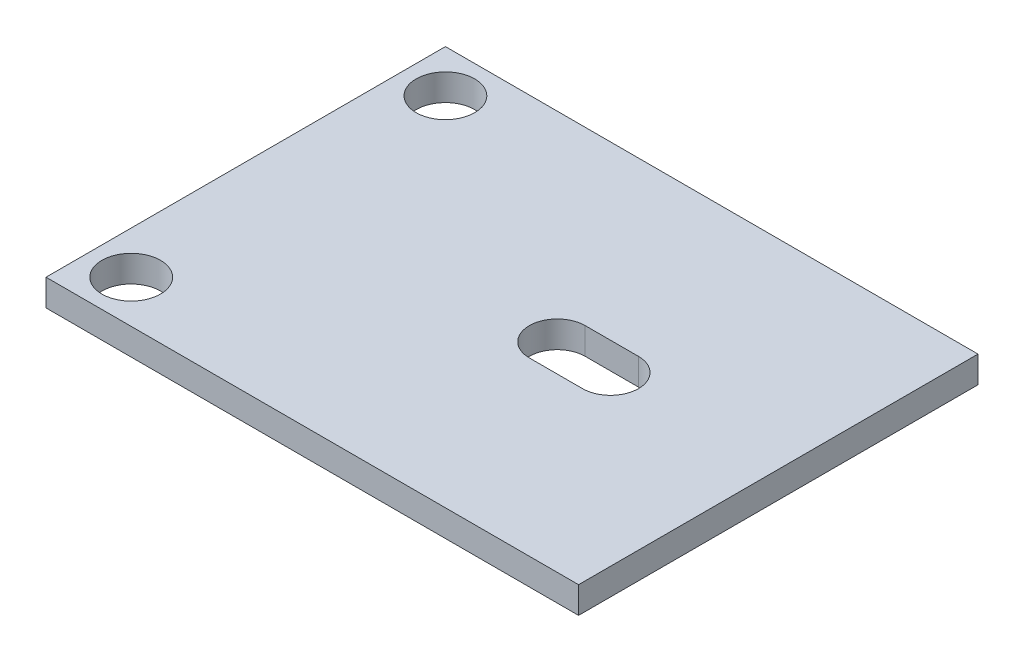
ISO-10303-21;
HEADER;
FILE_DESCRIPTION(('STEP AP214'),'2;1');
FILE_NAME('part.step','',(''),(''),'','','');
FILE_SCHEMA(('AUTOMOTIVE_DESIGN { 1 0 10303 214 1 1 1 1 }'));
ENDSEC;
DATA;
#1=APPLICATION_CONTEXT('core data for automotive mechanical design processes');
#2=APPLICATION_PROTOCOL_DEFINITION('international standard','automotive_design',2000,#1);
#3=PRODUCT_CONTEXT('',#1,'mechanical');
#4=PRODUCT('Part','Part','',(#3));
#5=PRODUCT_RELATED_PRODUCT_CATEGORY('part','',(#4));
#6=PRODUCT_DEFINITION_FORMATION('','',#4);
#7=PRODUCT_DEFINITION_CONTEXT('part definition',#1,'design');
#8=PRODUCT_DEFINITION('design','',#6,#7);
#9=PRODUCT_DEFINITION_SHAPE('','',#8);
#10=(LENGTH_UNIT() NAMED_UNIT(*) SI_UNIT(.MILLI.,.METRE.));
#11=(NAMED_UNIT(*) PLANE_ANGLE_UNIT() SI_UNIT($,.RADIAN.));
#12=(NAMED_UNIT(*) SI_UNIT($,.STERADIAN.) SOLID_ANGLE_UNIT());
#13=UNCERTAINTY_MEASURE_WITH_UNIT(LENGTH_MEASURE(1.E-05),#10,'distance_accuracy_value','');
#14=(GEOMETRIC_REPRESENTATION_CONTEXT(3) GLOBAL_UNCERTAINTY_ASSIGNED_CONTEXT((#13)) GLOBAL_UNIT_ASSIGNED_CONTEXT((#10,
#11,#12)) REPRESENTATION_CONTEXT('',''));
#15=CARTESIAN_POINT('',(0.,0.,0.));
#16=DIRECTION('',(0.,0.,1.));
#17=DIRECTION('',(1.,0.,0.));
#18=AXIS2_PLACEMENT_3D('',#15,#16,#17);
#19=CARTESIAN_POINT('',(0.,1.,7.5));
#20=DIRECTION('',(1.,0.,0.));
#21=DIRECTION('',(0.,0.,-1.));
#22=AXIS2_PLACEMENT_3D('',#19,#20,#21);
#23=PLANE('',#22);
#24=DIRECTION('',(0.,0.,1.));
#25=VECTOR('',#24,1.);
#26=CARTESIAN_POINT('',(0.,0.,7.5));
#27=LINE('',#26,#25);
#28=CARTESIAN_POINT('',(0.,0.,-7.5));
#29=VERTEX_POINT('',#28);
#30=CARTESIAN_POINT('',(0.,0.,7.5));
#31=VERTEX_POINT('',#30);
#32=EDGE_CURVE('E131',#29,#31,#27,.T.);
#33=ORIENTED_EDGE('',*,*,#32,.T.);
#34=DIRECTION('',(0.,-1.,0.));
#35=VECTOR('',#34,1.);
#36=CARTESIAN_POINT('',(0.,1.,7.5));
#37=LINE('',#36,#35);
#38=CARTESIAN_POINT('',(0.,1.,7.5));
#39=VERTEX_POINT('',#38);
#40=EDGE_CURVE('E11',#39,#31,#37,.T.);
#41=ORIENTED_EDGE('',*,*,#40,.F.);
#42=DIRECTION('',(0.,0.,1.));
#43=VECTOR('',#42,1.);
#44=CARTESIAN_POINT('',(0.,1.,7.5));
#45=LINE('',#44,#43);
#46=CARTESIAN_POINT('',(0.,1.,-7.5));
#47=VERTEX_POINT('',#46);
#48=EDGE_CURVE('E146',#47,#39,#45,.T.);
#49=ORIENTED_EDGE('',*,*,#48,.F.);
#50=DIRECTION('',(0.,-1.,0.));
#51=VECTOR('',#50,1.);
#52=CARTESIAN_POINT('',(0.,1.,-7.5));
#53=LINE('',#52,#51);
#54=EDGE_CURVE('E156',#47,#29,#53,.T.);
#55=ORIENTED_EDGE('',*,*,#54,.T.);
#56=EDGE_LOOP('',(#33,#41,#49,#55));
#57=FACE_BOUND('',#56,.T.);
#58=ADVANCED_FACE('F33',(#57),#23,.F.);
#59=CARTESIAN_POINT('',(0.,1.,7.5));
#60=DIRECTION('',(0.,0.,-1.));
#61=DIRECTION('',(-1.,0.,0.));
#62=AXIS2_PLACEMENT_3D('',#59,#60,#61);
#63=PLANE('',#62);
#64=DIRECTION('',(1.,0.,0.));
#65=VECTOR('',#64,1.);
#66=CARTESIAN_POINT('',(0.,0.,7.5));
#67=LINE('',#66,#65);
#68=CARTESIAN_POINT('',(20.,0.,7.5));
#69=VERTEX_POINT('',#68);
#70=EDGE_CURVE('E159',#31,#69,#67,.T.);
#71=ORIENTED_EDGE('',*,*,#70,.T.);
#72=DIRECTION('',(0.,-1.,0.));
#73=VECTOR('',#72,1.);
#74=CARTESIAN_POINT('',(20.,1.,7.5));
#75=LINE('',#74,#73);
#76=CARTESIAN_POINT('',(20.,1.,7.5));
#77=VERTEX_POINT('',#76);
#78=EDGE_CURVE('E40',#77,#69,#75,.T.);
#79=ORIENTED_EDGE('',*,*,#78,.F.);
#80=DIRECTION('',(1.,0.,0.));
#81=VECTOR('',#80,1.);
#82=CARTESIAN_POINT('',(0.,1.,7.5));
#83=LINE('',#82,#81);
#84=EDGE_CURVE('E149',#39,#77,#83,.T.);
#85=ORIENTED_EDGE('',*,*,#84,.F.);
#86=ORIENTED_EDGE('',*,*,#40,.T.);
#87=EDGE_LOOP('',(#71,#79,#85,#86));
#88=FACE_BOUND('',#87,.T.);
#89=ADVANCED_FACE('F188',(#88),#63,.F.);
#90=CARTESIAN_POINT('',(20.,1.,7.5));
#91=DIRECTION('',(-1.,0.,0.));
#92=DIRECTION('',(0.,0.,1.));
#93=AXIS2_PLACEMENT_3D('',#90,#91,#92);
#94=PLANE('',#93);
#95=DIRECTION('',(0.,0.,-1.));
#96=VECTOR('',#95,1.);
#97=CARTESIAN_POINT('',(20.,0.,7.5));
#98=LINE('',#97,#96);
#99=CARTESIAN_POINT('',(20.,0.,-7.5));
#100=VERTEX_POINT('',#99);
#101=EDGE_CURVE('E161',#69,#100,#98,.T.);
#102=ORIENTED_EDGE('',*,*,#101,.T.);
#103=DIRECTION('',(0.,-1.,0.));
#104=VECTOR('',#103,1.);
#105=CARTESIAN_POINT('',(20.,1.,-7.5));
#106=LINE('',#105,#104);
#107=CARTESIAN_POINT('',(20.,1.,-7.5));
#108=VERTEX_POINT('',#107);
#109=EDGE_CURVE('E166',#108,#100,#106,.T.);
#110=ORIENTED_EDGE('',*,*,#109,.F.);
#111=DIRECTION('',(0.,0.,-1.));
#112=VECTOR('',#111,1.);
#113=CARTESIAN_POINT('',(20.,1.,7.5));
#114=LINE('',#113,#112);
#115=EDGE_CURVE('E152',#77,#108,#114,.T.);
#116=ORIENTED_EDGE('',*,*,#115,.F.);
#117=ORIENTED_EDGE('',*,*,#78,.T.);
#118=EDGE_LOOP('',(#102,#110,#116,#117));
#119=FACE_BOUND('',#118,.T.);
#120=ADVANCED_FACE('F173',(#119),#94,.F.);
#121=CARTESIAN_POINT('',(0.,1.,-7.5));
#122=DIRECTION('',(0.,0.,1.));
#123=DIRECTION('',(1.,0.,0.));
#124=AXIS2_PLACEMENT_3D('',#121,#122,#123);
#125=PLANE('',#124);
#126=DIRECTION('',(-1.,0.,0.));
#127=VECTOR('',#126,1.);
#128=CARTESIAN_POINT('',(0.,0.,-7.5));
#129=LINE('',#128,#127);
#130=EDGE_CURVE('E150',#100,#29,#129,.T.);
#131=ORIENTED_EDGE('',*,*,#130,.T.);
#132=ORIENTED_EDGE('',*,*,#54,.F.);
#133=DIRECTION('',(-1.,0.,0.));
#134=VECTOR('',#133,1.);
#135=CARTESIAN_POINT('',(0.,1.,-7.5));
#136=LINE('',#135,#134);
#137=EDGE_CURVE('E154',#108,#47,#136,.T.);
#138=ORIENTED_EDGE('',*,*,#137,.F.);
#139=ORIENTED_EDGE('',*,*,#109,.T.);
#140=EDGE_LOOP('',(#131,#132,#138,#139));
#141=FACE_BOUND('',#140,.T.);
#142=ADVANCED_FACE('F181',(#141),#125,.F.);
#143=CARTESIAN_POINT('',(0.,1.,0.));
#144=DIRECTION('',(0.,-1.,0.));
#145=DIRECTION('',(0.,0.,-1.));
#146=AXIS2_PLACEMENT_3D('',#143,#144,#145);
#147=PLANE('',#146);
#148=DIRECTION('',(1.,0.,0.));
#149=VECTOR('',#148,1.);
#150=CARTESIAN_POINT('',(11.7,1.,1.05));
#151=LINE('',#150,#149);
#152=CARTESIAN_POINT('',(11.7,1.,1.05));
#153=VERTEX_POINT('',#152);
#154=CARTESIAN_POINT('',(13.7,1.,1.05));
#155=VERTEX_POINT('',#154);
#156=EDGE_CURVE('E124',#153,#155,#151,.T.);
#157=ORIENTED_EDGE('',*,*,#156,.F.);
#158=CARTESIAN_POINT('',(11.7,1.,0.));
#159=DIRECTION('',(0.,1.,0.));
#160=DIRECTION('',(0.,0.,1.));
#161=AXIS2_PLACEMENT_3D('',#158,#159,#160);
#162=CIRCLE('',#161,1.05);
#163=CARTESIAN_POINT('',(11.7,1.,-1.05));
#164=VERTEX_POINT('',#163);
#165=EDGE_CURVE('E47',#164,#153,#162,.T.);
#166=ORIENTED_EDGE('',*,*,#165,.F.);
#167=DIRECTION('',(-1.,0.,0.));
#168=VECTOR('',#167,1.);
#169=CARTESIAN_POINT('',(11.7,1.,-1.05));
#170=LINE('',#169,#168);
#171=CARTESIAN_POINT('',(13.7,1.,-1.05));
#172=VERTEX_POINT('',#171);
#173=EDGE_CURVE('E115',#172,#164,#170,.T.);
#174=ORIENTED_EDGE('',*,*,#173,.F.);
#175=CARTESIAN_POINT('',(13.7,1.,0.));
#176=DIRECTION('',(0.,1.,0.));
#177=DIRECTION('',(0.,0.,1.));
#178=AXIS2_PLACEMENT_3D('',#175,#176,#177);
#179=CIRCLE('',#178,1.05);
#180=EDGE_CURVE('E118',#155,#172,#179,.T.);
#181=ORIENTED_EDGE('',*,*,#180,.F.);
#182=EDGE_LOOP('',(#157,#166,#174,#181));
#183=FACE_BOUND('',#182,.T.);
#184=CARTESIAN_POINT('',(1.6,1.,-5.9));
#185=DIRECTION('',(0.,1.,0.));
#186=DIRECTION('',(0.,0.,1.));
#187=AXIS2_PLACEMENT_3D('',#184,#185,#186);
#188=CIRCLE('',#187,1.1);
#189=CARTESIAN_POINT('',(1.6,1.,-4.8));
#190=VERTEX_POINT('',#189);
#191=EDGE_CURVE('E137',#190,#190,#188,.T.);
#192=ORIENTED_EDGE('',*,*,#191,.F.);
#193=EDGE_LOOP('',(#192));
#194=FACE_BOUND('',#193,.T.);
#195=CARTESIAN_POINT('',(1.6,1.,5.9));
#196=DIRECTION('',(0.,1.,0.));
#197=DIRECTION('',(0.,0.,1.));
#198=AXIS2_PLACEMENT_3D('',#195,#196,#197);
#199=CIRCLE('',#198,1.1);
#200=CARTESIAN_POINT('',(1.6,1.,7.));
#201=VERTEX_POINT('',#200);
#202=EDGE_CURVE('E143',#201,#201,#199,.T.);
#203=ORIENTED_EDGE('',*,*,#202,.F.);
#204=EDGE_LOOP('',(#203));
#205=FACE_BOUND('',#204,.T.);
#206=ORIENTED_EDGE('',*,*,#48,.T.);
#207=ORIENTED_EDGE('',*,*,#84,.T.);
#208=ORIENTED_EDGE('',*,*,#115,.T.);
#209=ORIENTED_EDGE('',*,*,#137,.T.);
#210=EDGE_LOOP('',(#206,#207,#208,#209));
#211=FACE_BOUND('',#210,.T.);
#212=ADVANCED_FACE('F187',(#183,#194,#205,#211),#147,.F.);
#213=CARTESIAN_POINT('',(0.,0.,0.));
#214=DIRECTION('',(0.,-1.,0.));
#215=DIRECTION('',(0.,0.,-1.));
#216=AXIS2_PLACEMENT_3D('',#213,#214,#215);
#217=PLANE('',#216);
#218=CARTESIAN_POINT('',(11.7,0.,0.));
#219=DIRECTION('',(0.,1.,0.));
#220=DIRECTION('',(0.,0.,1.));
#221=AXIS2_PLACEMENT_3D('',#218,#219,#220);
#222=CIRCLE('',#221,1.05);
#223=CARTESIAN_POINT('',(11.7,0.,-1.05));
#224=VERTEX_POINT('',#223);
#225=CARTESIAN_POINT('',(11.7,0.,1.05));
#226=VERTEX_POINT('',#225);
#227=EDGE_CURVE('E99',#224,#226,#222,.T.);
#228=ORIENTED_EDGE('',*,*,#227,.T.);
#229=DIRECTION('',(1.,0.,0.));
#230=VECTOR('',#229,1.);
#231=CARTESIAN_POINT('',(11.7,0.,1.05));
#232=LINE('',#231,#230);
#233=CARTESIAN_POINT('',(13.7,0.,1.05));
#234=VERTEX_POINT('',#233);
#235=EDGE_CURVE('E108',#226,#234,#232,.T.);
#236=ORIENTED_EDGE('',*,*,#235,.T.);
#237=CARTESIAN_POINT('',(13.7,0.,0.));
#238=DIRECTION('',(0.,1.,0.));
#239=DIRECTION('',(0.,0.,1.));
#240=AXIS2_PLACEMENT_3D('',#237,#238,#239);
#241=CIRCLE('',#240,1.05);
#242=CARTESIAN_POINT('',(13.7,0.,-1.05));
#243=VERTEX_POINT('',#242);
#244=EDGE_CURVE('E55',#234,#243,#241,.T.);
#245=ORIENTED_EDGE('',*,*,#244,.T.);
#246=DIRECTION('',(-1.,0.,0.));
#247=VECTOR('',#246,1.);
#248=CARTESIAN_POINT('',(11.7,0.,-1.05));
#249=LINE('',#248,#247);
#250=EDGE_CURVE('E105',#243,#224,#249,.T.);
#251=ORIENTED_EDGE('',*,*,#250,.T.);
#252=EDGE_LOOP('',(#228,#236,#245,#251));
#253=FACE_BOUND('',#252,.T.);
#254=CARTESIAN_POINT('',(1.6,0.,-5.9));
#255=DIRECTION('',(0.,1.,0.));
#256=DIRECTION('',(0.,0.,1.));
#257=AXIS2_PLACEMENT_3D('',#254,#255,#256);
#258=CIRCLE('',#257,1.1);
#259=CARTESIAN_POINT('',(1.6,0.,-4.8));
#260=VERTEX_POINT('',#259);
#261=EDGE_CURVE('E125',#260,#260,#258,.T.);
#262=ORIENTED_EDGE('',*,*,#261,.T.);
#263=EDGE_LOOP('',(#262));
#264=FACE_BOUND('',#263,.T.);
#265=CARTESIAN_POINT('',(1.6,0.,5.9));
#266=DIRECTION('',(0.,1.,0.));
#267=DIRECTION('',(0.,0.,1.));
#268=AXIS2_PLACEMENT_3D('',#265,#266,#267);
#269=CIRCLE('',#268,1.1);
#270=CARTESIAN_POINT('',(1.6,0.,7.));
#271=VERTEX_POINT('',#270);
#272=EDGE_CURVE('E140',#271,#271,#269,.T.);
#273=ORIENTED_EDGE('',*,*,#272,.T.);
#274=EDGE_LOOP('',(#273));
#275=FACE_BOUND('',#274,.T.);
#276=ORIENTED_EDGE('',*,*,#32,.F.);
#277=ORIENTED_EDGE('',*,*,#130,.F.);
#278=ORIENTED_EDGE('',*,*,#101,.F.);
#279=ORIENTED_EDGE('',*,*,#70,.F.);
#280=EDGE_LOOP('',(#276,#277,#278,#279));
#281=FACE_BOUND('',#280,.T.);
#282=ADVANCED_FACE('F112',(#253,#264,#275,#281),#217,.T.);
#283=CARTESIAN_POINT('',(1.6,0.,5.9));
#284=DIRECTION('',(0.,1.,0.));
#285=DIRECTION('',(0.,0.,1.));
#286=AXIS2_PLACEMENT_3D('',#283,#284,#285);
#287=CYLINDRICAL_SURFACE('',#286,1.1);
#288=ORIENTED_EDGE('',*,*,#272,.F.);
#289=EDGE_LOOP('',(#288));
#290=FACE_BOUND('',#289,.T.);
#291=ORIENTED_EDGE('',*,*,#202,.T.);
#292=EDGE_LOOP('',(#291));
#293=FACE_BOUND('',#292,.T.);
#294=ADVANCED_FACE('F200',(#290,#293),#287,.F.);
#295=CARTESIAN_POINT('',(1.6,0.,-5.9));
#296=DIRECTION('',(0.,1.,0.));
#297=DIRECTION('',(0.,0.,1.));
#298=AXIS2_PLACEMENT_3D('',#295,#296,#297);
#299=CYLINDRICAL_SURFACE('',#298,1.1);
#300=ORIENTED_EDGE('',*,*,#261,.F.);
#301=EDGE_LOOP('',(#300));
#302=FACE_BOUND('',#301,.T.);
#303=ORIENTED_EDGE('',*,*,#191,.T.);
#304=EDGE_LOOP('',(#303));
#305=FACE_BOUND('',#304,.T.);
#306=ADVANCED_FACE('F206',(#302,#305),#299,.F.);
#307=CARTESIAN_POINT('',(11.7,0.,0.));
#308=DIRECTION('',(0.,1.,0.));
#309=DIRECTION('',(0.,0.,1.));
#310=AXIS2_PLACEMENT_3D('',#307,#308,#309);
#311=CYLINDRICAL_SURFACE('',#310,1.05);
#312=ORIENTED_EDGE('',*,*,#165,.T.);
#313=DIRECTION('',(0.,1.,0.));
#314=VECTOR('',#313,1.);
#315=CARTESIAN_POINT('',(11.7,0.,1.05));
#316=LINE('',#315,#314);
#317=EDGE_CURVE('E95',#226,#153,#316,.T.);
#318=ORIENTED_EDGE('',*,*,#317,.F.);
#319=ORIENTED_EDGE('',*,*,#227,.F.);
#320=DIRECTION('',(0.,1.,0.));
#321=VECTOR('',#320,1.);
#322=CARTESIAN_POINT('',(11.7,0.,-1.05));
#323=LINE('',#322,#321);
#324=EDGE_CURVE('E129',#224,#164,#323,.T.);
#325=ORIENTED_EDGE('',*,*,#324,.T.);
#326=EDGE_LOOP('',(#312,#318,#319,#325));
#327=FACE_BOUND('',#326,.T.);
#328=ADVANCED_FACE('F97',(#327),#311,.F.);
#329=CARTESIAN_POINT('',(11.7,0.,-1.05));
#330=DIRECTION('',(0.,0.,-1.));
#331=DIRECTION('',(-1.,0.,0.));
#332=AXIS2_PLACEMENT_3D('',#329,#330,#331);
#333=PLANE('',#332);
#334=ORIENTED_EDGE('',*,*,#173,.T.);
#335=ORIENTED_EDGE('',*,*,#324,.F.);
#336=ORIENTED_EDGE('',*,*,#250,.F.);
#337=DIRECTION('',(0.,1.,0.));
#338=VECTOR('',#337,1.);
#339=CARTESIAN_POINT('',(13.7,0.,-1.05));
#340=LINE('',#339,#338);
#341=EDGE_CURVE('E132',#243,#172,#340,.T.);
#342=ORIENTED_EDGE('',*,*,#341,.T.);
#343=EDGE_LOOP('',(#334,#335,#336,#342));
#344=FACE_BOUND('',#343,.T.);
#345=ADVANCED_FACE('F213',(#344),#333,.F.);
#346=CARTESIAN_POINT('',(13.7,0.,0.));
#347=DIRECTION('',(0.,1.,0.));
#348=DIRECTION('',(0.,0.,1.));
#349=AXIS2_PLACEMENT_3D('',#346,#347,#348);
#350=CYLINDRICAL_SURFACE('',#349,1.05);
#351=ORIENTED_EDGE('',*,*,#180,.T.);
#352=ORIENTED_EDGE('',*,*,#341,.F.);
#353=ORIENTED_EDGE('',*,*,#244,.F.);
#354=DIRECTION('',(0.,1.,0.));
#355=VECTOR('',#354,1.);
#356=CARTESIAN_POINT('',(13.7,0.,1.05));
#357=LINE('',#356,#355);
#358=EDGE_CURVE('E104',#234,#155,#357,.T.);
#359=ORIENTED_EDGE('',*,*,#358,.T.);
#360=EDGE_LOOP('',(#351,#352,#353,#359));
#361=FACE_BOUND('',#360,.T.);
#362=ADVANCED_FACE('F216',(#361),#350,.F.);
#363=CARTESIAN_POINT('',(11.7,0.,1.05));
#364=DIRECTION('',(0.,0.,1.));
#365=DIRECTION('',(1.,0.,0.));
#366=AXIS2_PLACEMENT_3D('',#363,#364,#365);
#367=PLANE('',#366);
#368=ORIENTED_EDGE('',*,*,#156,.T.);
#369=ORIENTED_EDGE('',*,*,#358,.F.);
#370=ORIENTED_EDGE('',*,*,#235,.F.);
#371=ORIENTED_EDGE('',*,*,#317,.T.);
#372=EDGE_LOOP('',(#368,#369,#370,#371));
#373=FACE_BOUND('',#372,.T.);
#374=ADVANCED_FACE('F109',(#373),#367,.F.);
#375=CLOSED_SHELL('',(#58,#89,#120,#142,#212,#282,#294,#306,#328,#345,#362,#374));
#376=MANIFOLD_SOLID_BREP('B2',#375);
#377=ADVANCED_BREP_SHAPE_REPRESENTATION('',(#18,#376),#14);
#378=SHAPE_DEFINITION_REPRESENTATION(#9,#377);
ENDSEC;
END-ISO-10303-21;
